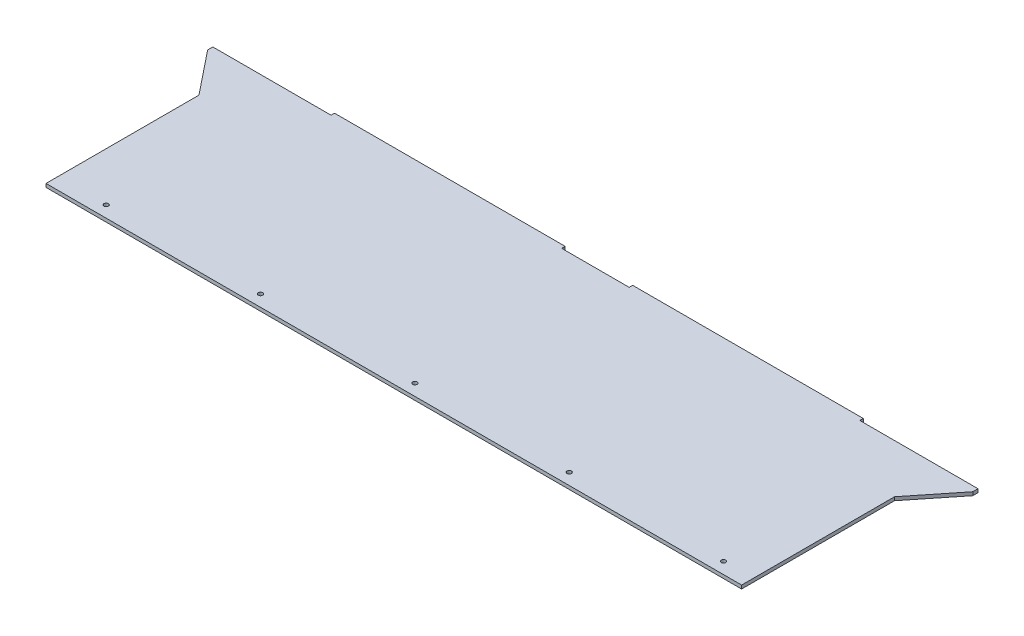
ISO-10303-21;
HEADER;
FILE_DESCRIPTION(('STEP AP214'),'2;1');
FILE_NAME('part.step','',(''),(''),'','','');
FILE_SCHEMA(('AUTOMOTIVE_DESIGN { 1 0 10303 214 1 1 1 1 }'));
ENDSEC;
DATA;
#1=APPLICATION_CONTEXT('core data for automotive mechanical design processes');
#2=APPLICATION_PROTOCOL_DEFINITION('international standard','automotive_design',2000,#1);
#3=PRODUCT_CONTEXT('',#1,'mechanical');
#4=PRODUCT('Part','Part','',(#3));
#5=PRODUCT_RELATED_PRODUCT_CATEGORY('part','',(#4));
#6=PRODUCT_DEFINITION_FORMATION('','',#4);
#7=PRODUCT_DEFINITION_CONTEXT('part definition',#1,'design');
#8=PRODUCT_DEFINITION('design','',#6,#7);
#9=PRODUCT_DEFINITION_SHAPE('','',#8);
#10=(LENGTH_UNIT() NAMED_UNIT(*) SI_UNIT(.MILLI.,.METRE.));
#11=(NAMED_UNIT(*) PLANE_ANGLE_UNIT() SI_UNIT($,.RADIAN.));
#12=(NAMED_UNIT(*) SI_UNIT($,.STERADIAN.) SOLID_ANGLE_UNIT());
#13=UNCERTAINTY_MEASURE_WITH_UNIT(LENGTH_MEASURE(1.E-05),#10,'distance_accuracy_value','');
#14=(GEOMETRIC_REPRESENTATION_CONTEXT(3) GLOBAL_UNCERTAINTY_ASSIGNED_CONTEXT((#13)) GLOBAL_UNIT_ASSIGNED_CONTEXT((#10,
#11,#12)) REPRESENTATION_CONTEXT('',''));
#15=CARTESIAN_POINT('',(0.,0.,0.));
#16=DIRECTION('',(0.,0.,1.));
#17=DIRECTION('',(1.,0.,0.));
#18=AXIS2_PLACEMENT_3D('',#15,#16,#17);
#19=CARTESIAN_POINT('',(290.6522,-8.4125,81.534));
#20=DIRECTION('',(0.,1.,0.));
#21=DIRECTION('',(0.,0.,1.));
#22=AXIS2_PLACEMENT_3D('',#19,#20,#21);
#23=CYLINDRICAL_SURFACE('',#22,2.02500000000001);
#24=CARTESIAN_POINT('',(290.6522,1.5875,81.534));
#25=DIRECTION('',(0.,1.,0.));
#26=DIRECTION('',(0.,0.,1.));
#27=AXIS2_PLACEMENT_3D('',#24,#25,#26);
#28=CIRCLE('',#27,2.02500000000001);
#29=CARTESIAN_POINT('',(290.6522,1.5875,83.559));
#30=VERTEX_POINT('',#29);
#31=EDGE_CURVE('E42',#30,#30,#28,.T.);
#32=ORIENTED_EDGE('',*,*,#31,.T.);
#33=EDGE_LOOP('',(#32));
#34=FACE_BOUND('',#33,.T.);
#35=CARTESIAN_POINT('',(290.6522,-1.5875,81.534));
#36=DIRECTION('',(0.,1.,0.));
#37=DIRECTION('',(0.,0.,1.));
#38=AXIS2_PLACEMENT_3D('',#35,#36,#37);
#39=CIRCLE('',#38,2.02500000000001);
#40=CARTESIAN_POINT('',(290.6522,-1.5875,83.559));
#41=VERTEX_POINT('',#40);
#42=EDGE_CURVE('E11',#41,#41,#39,.T.);
#43=ORIENTED_EDGE('',*,*,#42,.F.);
#44=EDGE_LOOP('',(#43));
#45=FACE_BOUND('',#44,.T.);
#46=ADVANCED_FACE('F35',(#34,#45),#23,.F.);
#47=CARTESIAN_POINT('',(149.6822,-8.4125,81.534));
#48=DIRECTION('',(0.,1.,0.));
#49=DIRECTION('',(0.,0.,1.));
#50=AXIS2_PLACEMENT_3D('',#47,#48,#49);
#51=CYLINDRICAL_SURFACE('',#50,2.02500000000001);
#52=CARTESIAN_POINT('',(149.6822,1.5875,81.534));
#53=DIRECTION('',(0.,1.,0.));
#54=DIRECTION('',(0.,0.,1.));
#55=AXIS2_PLACEMENT_3D('',#52,#53,#54);
#56=CIRCLE('',#55,2.02500000000001);
#57=CARTESIAN_POINT('',(149.6822,1.5875,83.559));
#58=VERTEX_POINT('',#57);
#59=EDGE_CURVE('E286',#58,#58,#56,.T.);
#60=ORIENTED_EDGE('',*,*,#59,.T.);
#61=EDGE_LOOP('',(#60));
#62=FACE_BOUND('',#61,.T.);
#63=CARTESIAN_POINT('',(149.6822,-1.5875,81.534));
#64=DIRECTION('',(0.,1.,0.));
#65=DIRECTION('',(0.,0.,1.));
#66=AXIS2_PLACEMENT_3D('',#63,#64,#65);
#67=CIRCLE('',#66,2.02500000000001);
#68=CARTESIAN_POINT('',(149.6822,-1.5875,83.559));
#69=VERTEX_POINT('',#68);
#70=EDGE_CURVE('E289',#69,#69,#67,.T.);
#71=ORIENTED_EDGE('',*,*,#70,.F.);
#72=EDGE_LOOP('',(#71));
#73=FACE_BOUND('',#72,.T.);
#74=ADVANCED_FACE('F314',(#62,#73),#51,.F.);
#75=CARTESIAN_POINT('',(8.71219999999989,-8.4125,81.534));
#76=DIRECTION('',(0.,1.,0.));
#77=DIRECTION('',(0.,0.,1.));
#78=AXIS2_PLACEMENT_3D('',#75,#76,#77);
#79=CYLINDRICAL_SURFACE('',#78,2.02500000000001);
#80=CARTESIAN_POINT('',(8.71219999999989,1.5875,81.534));
#81=DIRECTION('',(0.,1.,0.));
#82=DIRECTION('',(0.,0.,1.));
#83=AXIS2_PLACEMENT_3D('',#80,#81,#82);
#84=CIRCLE('',#83,2.02500000000001);
#85=CARTESIAN_POINT('',(8.71219999999989,1.5875,83.559));
#86=VERTEX_POINT('',#85);
#87=EDGE_CURVE('E278',#86,#86,#84,.T.);
#88=ORIENTED_EDGE('',*,*,#87,.T.);
#89=EDGE_LOOP('',(#88));
#90=FACE_BOUND('',#89,.T.);
#91=CARTESIAN_POINT('',(8.71219999999989,-1.5875,81.534));
#92=DIRECTION('',(0.,1.,0.));
#93=DIRECTION('',(0.,0.,1.));
#94=AXIS2_PLACEMENT_3D('',#91,#92,#93);
#95=CIRCLE('',#94,2.02500000000001);
#96=CARTESIAN_POINT('',(8.71219999999989,-1.5875,83.559));
#97=VERTEX_POINT('',#96);
#98=EDGE_CURVE('E283',#97,#97,#95,.T.);
#99=ORIENTED_EDGE('',*,*,#98,.F.);
#100=EDGE_LOOP('',(#99));
#101=FACE_BOUND('',#100,.T.);
#102=ADVANCED_FACE('F318',(#90,#101),#79,.F.);
#103=CARTESIAN_POINT('',(-317.6778,1.5875,-92.075));
#104=DIRECTION('',(1.,0.,0.));
#105=DIRECTION('',(0.,0.,-1.));
#106=AXIS2_PLACEMENT_3D('',#103,#104,#105);
#107=PLANE('',#106);
#108=DIRECTION('',(0.,1.,0.));
#109=VECTOR('',#108,1.);
#110=CARTESIAN_POINT('',(-317.6778,-1.5875,-47.6250000000001));
#111=LINE('',#110,#109);
#112=CARTESIAN_POINT('',(-317.6778,-1.5875,-47.6250000000001));
#113=VERTEX_POINT('',#112);
#114=CARTESIAN_POINT('',(-317.6778,1.5875,-47.6250000000001));
#115=VERTEX_POINT('',#114);
#116=EDGE_CURVE('E57',#113,#115,#111,.T.);
#117=ORIENTED_EDGE('',*,*,#116,.F.);
#118=DIRECTION('',(0.,0.,1.));
#119=VECTOR('',#118,1.);
#120=CARTESIAN_POINT('',(-317.6778,-1.5875,-92.075));
#121=LINE('',#120,#119);
#122=CARTESIAN_POINT('',(-317.6778,-1.5875,92.075));
#123=VERTEX_POINT('',#122);
#124=EDGE_CURVE('E161',#113,#123,#121,.T.);
#125=ORIENTED_EDGE('',*,*,#124,.T.);
#126=DIRECTION('',(0.,-1.,0.));
#127=VECTOR('',#126,1.);
#128=CARTESIAN_POINT('',(-317.6778,1.5875,92.075));
#129=LINE('',#128,#127);
#130=CARTESIAN_POINT('',(-317.6778,1.5875,92.075));
#131=VERTEX_POINT('',#130);
#132=EDGE_CURVE('E275',#131,#123,#129,.T.);
#133=ORIENTED_EDGE('',*,*,#132,.F.);
#134=DIRECTION('',(0.,0.,1.));
#135=VECTOR('',#134,1.);
#136=CARTESIAN_POINT('',(-317.6778,1.5875,-92.075));
#137=LINE('',#136,#135);
#138=EDGE_CURVE('E263',#115,#131,#137,.T.);
#139=ORIENTED_EDGE('',*,*,#138,.F.);
#140=EDGE_LOOP('',(#117,#125,#133,#139));
#141=FACE_BOUND('',#140,.T.);
#142=ADVANCED_FACE('F323',(#141),#107,.F.);
#143=CARTESIAN_POINT('',(-317.6778,1.5875,-92.075));
#144=DIRECTION('',(0.,0.,1.));
#145=DIRECTION('',(1.,0.,0.));
#146=AXIS2_PLACEMENT_3D('',#143,#144,#145);
#147=PLANE('',#146);
#148=DIRECTION('',(0.,1.,0.));
#149=VECTOR('',#148,1.);
#150=CARTESIAN_POINT('',(-241.4778,0.,-92.075));
#151=LINE('',#150,#149);
#152=CARTESIAN_POINT('',(-241.4778,-1.5875,-92.075));
#153=VERTEX_POINT('',#152);
#154=CARTESIAN_POINT('',(-241.4778,1.5875,-92.075));
#155=VERTEX_POINT('',#154);
#156=EDGE_CURVE('E213',#153,#155,#151,.T.);
#157=ORIENTED_EDGE('',*,*,#156,.F.);
#158=DIRECTION('',(-1.,0.,0.));
#159=VECTOR('',#158,1.);
#160=CARTESIAN_POINT('',(-317.6778,-1.5875,-92.075));
#161=LINE('',#160,#159);
#162=CARTESIAN_POINT('',(-349.4278,-1.5875,-92.075));
#163=VERTEX_POINT('',#162);
#164=EDGE_CURVE('E164',#153,#163,#161,.T.);
#165=ORIENTED_EDGE('',*,*,#164,.T.);
#166=DIRECTION('',(0.,1.,0.));
#167=VECTOR('',#166,1.);
#168=CARTESIAN_POINT('',(-349.4278,-1.5875,-92.075));
#169=LINE('',#168,#167);
#170=CARTESIAN_POINT('',(-349.4278,1.5875,-92.075));
#171=VERTEX_POINT('',#170);
#172=EDGE_CURVE('E203',#163,#171,#169,.T.);
#173=ORIENTED_EDGE('',*,*,#172,.T.);
#174=DIRECTION('',(-1.,0.,0.));
#175=VECTOR('',#174,1.);
#176=CARTESIAN_POINT('',(-317.6778,1.5875,-92.075));
#177=LINE('',#176,#175);
#178=EDGE_CURVE('E260',#155,#171,#177,.T.);
#179=ORIENTED_EDGE('',*,*,#178,.F.);
#180=EDGE_LOOP('',(#157,#165,#173,#179));
#181=FACE_BOUND('',#180,.T.);
#182=ADVANCED_FACE('F335',(#181),#147,.F.);
#183=CARTESIAN_POINT('',(30.8229000000015,-1.5875,-92.075));
#184=VERTEX_POINT('',#183);
#185=CARTESIAN_POINT('',(-30.8229000000015,-1.5875,-92.075));
#186=VERTEX_POINT('',#185);
#187=EDGE_CURVE('E162',#184,#186,#161,.T.);
#188=ORIENTED_EDGE('',*,*,#187,.T.);
#189=DIRECTION('',(0.,1.,0.));
#190=VECTOR('',#189,1.);
#191=CARTESIAN_POINT('',(-30.8229000000015,0.,-92.075));
#192=LINE('',#191,#190);
#193=CARTESIAN_POINT('',(-30.8229000000015,1.5875,-92.075));
#194=VERTEX_POINT('',#193);
#195=EDGE_CURVE('E206',#186,#194,#192,.T.);
#196=ORIENTED_EDGE('',*,*,#195,.T.);
#197=CARTESIAN_POINT('',(30.8229000000015,1.5875,-92.075));
#198=VERTEX_POINT('',#197);
#199=EDGE_CURVE('E264',#198,#194,#177,.T.);
#200=ORIENTED_EDGE('',*,*,#199,.F.);
#201=DIRECTION('',(0.,-1.,0.));
#202=VECTOR('',#201,1.);
#203=CARTESIAN_POINT('',(30.8229000000015,0.,-92.075));
#204=LINE('',#203,#202);
#205=EDGE_CURVE('E234',#198,#184,#204,.T.);
#206=ORIENTED_EDGE('',*,*,#205,.T.);
#207=EDGE_LOOP('',(#188,#196,#200,#206));
#208=FACE_BOUND('',#207,.T.);
#209=ADVANCED_FACE('F331',(#208),#147,.F.);
#210=CARTESIAN_POINT('',(317.6778,1.5875,-92.075));
#211=DIRECTION('',(-1.,0.,0.));
#212=DIRECTION('',(0.,0.,1.));
#213=AXIS2_PLACEMENT_3D('',#210,#211,#212);
#214=PLANE('',#213);
#215=DIRECTION('',(0.,0.,-1.));
#216=VECTOR('',#215,1.);
#217=CARTESIAN_POINT('',(317.6778,-1.5875,-92.075));
#218=LINE('',#217,#216);
#219=CARTESIAN_POINT('',(317.6778,-1.5875,92.075));
#220=VERTEX_POINT('',#219);
#221=CARTESIAN_POINT('',(317.6778,-1.5875,-47.6250000000001));
#222=VERTEX_POINT('',#221);
#223=EDGE_CURVE('E256',#220,#222,#218,.T.);
#224=ORIENTED_EDGE('',*,*,#223,.T.);
#225=DIRECTION('',(0.,1.,0.));
#226=VECTOR('',#225,1.);
#227=CARTESIAN_POINT('',(317.6778,-1.5875,-47.6250000000001));
#228=LINE('',#227,#226);
#229=CARTESIAN_POINT('',(317.6778,1.5875,-47.6250000000001));
#230=VERTEX_POINT('',#229);
#231=EDGE_CURVE('E173',#222,#230,#228,.T.);
#232=ORIENTED_EDGE('',*,*,#231,.T.);
#233=DIRECTION('',(0.,0.,-1.));
#234=VECTOR('',#233,1.);
#235=CARTESIAN_POINT('',(317.6778,1.5875,-92.075));
#236=LINE('',#235,#234);
#237=CARTESIAN_POINT('',(317.6778,1.5875,92.075));
#238=VERTEX_POINT('',#237);
#239=EDGE_CURVE('E257',#238,#230,#236,.T.);
#240=ORIENTED_EDGE('',*,*,#239,.F.);
#241=DIRECTION('',(0.,-1.,0.));
#242=VECTOR('',#241,1.);
#243=CARTESIAN_POINT('',(317.6778,1.5875,92.075));
#244=LINE('',#243,#242);
#245=EDGE_CURVE('E268',#238,#220,#244,.T.);
#246=ORIENTED_EDGE('',*,*,#245,.T.);
#247=EDGE_LOOP('',(#224,#232,#240,#246));
#248=FACE_BOUND('',#247,.T.);
#249=ADVANCED_FACE('F328',(#248),#214,.F.);
#250=CARTESIAN_POINT('',(349.4278,-1.5875,-92.075));
#251=VERTEX_POINT('',#250);
#252=CARTESIAN_POINT('',(241.4778,-1.5875,-92.075));
#253=VERTEX_POINT('',#252);
#254=EDGE_CURVE('E148',#251,#253,#161,.T.);
#255=ORIENTED_EDGE('',*,*,#254,.T.);
#256=DIRECTION('',(0.,1.,0.));
#257=VECTOR('',#256,1.);
#258=CARTESIAN_POINT('',(241.4778,2.1109780590225E-11,-92.075));
#259=LINE('',#258,#257);
#260=CARTESIAN_POINT('',(241.4778,1.5875,-92.075));
#261=VERTEX_POINT('',#260);
#262=EDGE_CURVE('E239',#253,#261,#259,.T.);
#263=ORIENTED_EDGE('',*,*,#262,.T.);
#264=CARTESIAN_POINT('',(349.4278,1.5875,-92.075));
#265=VERTEX_POINT('',#264);
#266=EDGE_CURVE('E169',#265,#261,#177,.T.);
#267=ORIENTED_EDGE('',*,*,#266,.F.);
#268=DIRECTION('',(0.,1.,0.));
#269=VECTOR('',#268,1.);
#270=CARTESIAN_POINT('',(349.4278,-1.5875,-92.075));
#271=LINE('',#270,#269);
#272=EDGE_CURVE('E166',#251,#265,#271,.T.);
#273=ORIENTED_EDGE('',*,*,#272,.F.);
#274=EDGE_LOOP('',(#255,#263,#267,#273));
#275=FACE_BOUND('',#274,.T.);
#276=ADVANCED_FACE('F167',(#275),#147,.F.);
#277=CARTESIAN_POINT('',(-317.6778,1.5875,92.075));
#278=DIRECTION('',(0.,0.,-1.));
#279=DIRECTION('',(-1.,0.,0.));
#280=AXIS2_PLACEMENT_3D('',#277,#278,#279);
#281=PLANE('',#280);
#282=DIRECTION('',(1.,0.,0.));
#283=VECTOR('',#282,1.);
#284=CARTESIAN_POINT('',(-317.6778,-1.5875,92.075));
#285=LINE('',#284,#283);
#286=EDGE_CURVE('E261',#123,#220,#285,.T.);
#287=ORIENTED_EDGE('',*,*,#286,.T.);
#288=ORIENTED_EDGE('',*,*,#245,.F.);
#289=DIRECTION('',(1.,0.,0.));
#290=VECTOR('',#289,1.);
#291=CARTESIAN_POINT('',(-317.6778,1.5875,92.075));
#292=LINE('',#291,#290);
#293=EDGE_CURVE('E266',#131,#238,#292,.T.);
#294=ORIENTED_EDGE('',*,*,#293,.F.);
#295=ORIENTED_EDGE('',*,*,#132,.T.);
#296=EDGE_LOOP('',(#287,#288,#294,#295));
#297=FACE_BOUND('',#296,.T.);
#298=ADVANCED_FACE('F298',(#297),#281,.F.);
#299=CARTESIAN_POINT('',(0.,1.5875,0.));
#300=DIRECTION('',(0.,1.,0.));
#301=DIRECTION('',(0.,0.,1.));
#302=AXIS2_PLACEMENT_3D('',#299,#300,#301);
#303=PLANE('',#302);
#304=CARTESIAN_POINT('',(-132.2578,1.5875,81.534));
#305=DIRECTION('',(0.,1.,0.));
#306=DIRECTION('',(0.,0.,1.));
#307=AXIS2_PLACEMENT_3D('',#304,#305,#306);
#308=CIRCLE('',#307,2.02500000000001);
#309=CARTESIAN_POINT('',(-132.2578,1.5875,83.559));
#310=VERTEX_POINT('',#309);
#311=EDGE_CURVE('E507',#310,#310,#308,.T.);
#312=ORIENTED_EDGE('',*,*,#311,.F.);
#313=EDGE_LOOP('',(#312));
#314=FACE_BOUND('',#313,.T.);
#315=CARTESIAN_POINT('',(-273.2278,1.5875,81.534));
#316=DIRECTION('',(0.,1.,0.));
#317=DIRECTION('',(0.,0.,1.));
#318=AXIS2_PLACEMENT_3D('',#315,#316,#317);
#319=CIRCLE('',#318,2.02500000000001);
#320=CARTESIAN_POINT('',(-273.2278,1.5875,83.559));
#321=VERTEX_POINT('',#320);
#322=EDGE_CURVE('E183',#321,#321,#319,.T.);
#323=ORIENTED_EDGE('',*,*,#322,.F.);
#324=EDGE_LOOP('',(#323));
#325=FACE_BOUND('',#324,.T.);
#326=ORIENTED_EDGE('',*,*,#239,.T.);
#327=DIRECTION('',(-0.624695047554425,0.,0.78086880944303));
#328=VECTOR('',#327,1.);
#329=CARTESIAN_POINT('',(170.474268292683,1.5875,136.379414634146));
#330=LINE('',#329,#328);
#331=CARTESIAN_POINT('',(349.4278,1.5875,-87.3125));
#332=VERTEX_POINT('',#331);
#333=EDGE_CURVE('E49',#332,#230,#330,.T.);
#334=ORIENTED_EDGE('',*,*,#333,.F.);
#335=DIRECTION('',(0.,0.,1.));
#336=VECTOR('',#335,1.);
#337=CARTESIAN_POINT('',(349.4278,1.5875,0.));
#338=LINE('',#337,#336);
#339=EDGE_CURVE('E180',#265,#332,#338,.T.);
#340=ORIENTED_EDGE('',*,*,#339,.F.);
#341=ORIENTED_EDGE('',*,*,#266,.T.);
#342=DIRECTION('',(0.,0.,1.));
#343=VECTOR('',#342,1.);
#344=CARTESIAN_POINT('',(241.4778,1.5875,-95.25));
#345=LINE('',#344,#343);
#346=CARTESIAN_POINT('',(241.4778,1.5875,-95.25));
#347=VERTEX_POINT('',#346);
#348=EDGE_CURVE('E252',#347,#261,#345,.T.);
#349=ORIENTED_EDGE('',*,*,#348,.F.);
#350=DIRECTION('',(1.,0.,0.));
#351=VECTOR('',#350,1.);
#352=CARTESIAN_POINT('',(0.,1.5875,-95.25));
#353=LINE('',#352,#351);
#354=CARTESIAN_POINT('',(30.8229000000015,1.5875,-95.25));
#355=VERTEX_POINT('',#354);
#356=EDGE_CURVE('E238',#355,#347,#353,.T.);
#357=ORIENTED_EDGE('',*,*,#356,.F.);
#358=DIRECTION('',(0.,0.,1.));
#359=VECTOR('',#358,1.);
#360=CARTESIAN_POINT('',(30.8229000000015,1.5875,-95.25));
#361=LINE('',#360,#359);
#362=EDGE_CURVE('E254',#355,#198,#361,.T.);
#363=ORIENTED_EDGE('',*,*,#362,.T.);
#364=ORIENTED_EDGE('',*,*,#199,.T.);
#365=DIRECTION('',(0.,0.,1.));
#366=VECTOR('',#365,1.);
#367=CARTESIAN_POINT('',(-30.8229000000015,1.5875,-95.25));
#368=LINE('',#367,#366);
#369=CARTESIAN_POINT('',(-30.8229000000015,1.5875,-95.25));
#370=VERTEX_POINT('',#369);
#371=EDGE_CURVE('E219',#370,#194,#368,.T.);
#372=ORIENTED_EDGE('',*,*,#371,.F.);
#373=DIRECTION('',(1.,0.,0.));
#374=VECTOR('',#373,1.);
#375=CARTESIAN_POINT('',(0.,1.5875,-95.25));
#376=LINE('',#375,#374);
#377=CARTESIAN_POINT('',(-241.4778,1.5875,-95.25));
#378=VERTEX_POINT('',#377);
#379=EDGE_CURVE('E217',#378,#370,#376,.T.);
#380=ORIENTED_EDGE('',*,*,#379,.F.);
#381=DIRECTION('',(0.,0.,1.));
#382=VECTOR('',#381,1.);
#383=CARTESIAN_POINT('',(-241.4778,1.5875,-95.25));
#384=LINE('',#383,#382);
#385=EDGE_CURVE('E225',#378,#155,#384,.T.);
#386=ORIENTED_EDGE('',*,*,#385,.T.);
#387=ORIENTED_EDGE('',*,*,#178,.T.);
#388=DIRECTION('',(0.,0.,1.));
#389=VECTOR('',#388,1.);
#390=CARTESIAN_POINT('',(-349.4278,1.5875,0.));
#391=LINE('',#390,#389);
#392=CARTESIAN_POINT('',(-349.4278,1.5875,-87.3125));
#393=VERTEX_POINT('',#392);
#394=EDGE_CURVE('E189',#171,#393,#391,.T.);
#395=ORIENTED_EDGE('',*,*,#394,.T.);
#396=DIRECTION('',(0.624695047554425,0.,0.78086880944303));
#397=VECTOR('',#396,1.);
#398=CARTESIAN_POINT('',(-170.474268292683,1.5875,136.379414634146));
#399=LINE('',#398,#397);
#400=EDGE_CURVE('E195',#393,#115,#399,.T.);
#401=ORIENTED_EDGE('',*,*,#400,.T.);
#402=ORIENTED_EDGE('',*,*,#138,.T.);
#403=ORIENTED_EDGE('',*,*,#293,.T.);
#404=EDGE_LOOP('',(#326,#334,#340,#341,#349,#357,#363,#364,#372,#380,#386,#387,#395,#401,#402,#403));
#405=FACE_BOUND('',#404,.T.);
#406=ORIENTED_EDGE('',*,*,#87,.F.);
#407=EDGE_LOOP('',(#406));
#408=FACE_BOUND('',#407,.T.);
#409=ORIENTED_EDGE('',*,*,#59,.F.);
#410=EDGE_LOOP('',(#409));
#411=FACE_BOUND('',#410,.T.);
#412=ORIENTED_EDGE('',*,*,#31,.F.);
#413=EDGE_LOOP('',(#412));
#414=FACE_BOUND('',#413,.T.);
#415=ADVANCED_FACE('F296',(#314,#325,#405,#408,#411,#414),#303,.T.);
#416=CARTESIAN_POINT('',(0.,-1.5875,0.));
#417=DIRECTION('',(0.,1.,0.));
#418=DIRECTION('',(0.,0.,1.));
#419=AXIS2_PLACEMENT_3D('',#416,#417,#418);
#420=PLANE('',#419);
#421=CARTESIAN_POINT('',(-132.2578,-1.5875,81.534));
#422=DIRECTION('',(0.,1.,0.));
#423=DIRECTION('',(0.,0.,1.));
#424=AXIS2_PLACEMENT_3D('',#421,#422,#423);
#425=CIRCLE('',#424,2.02500000000001);
#426=CARTESIAN_POINT('',(-132.2578,-1.5875,83.559));
#427=VERTEX_POINT('',#426);
#428=EDGE_CURVE('E510',#427,#427,#425,.T.);
#429=ORIENTED_EDGE('',*,*,#428,.T.);
#430=EDGE_LOOP('',(#429));
#431=FACE_BOUND('',#430,.T.);
#432=CARTESIAN_POINT('',(-273.2278,-1.5875,81.534));
#433=DIRECTION('',(0.,1.,0.));
#434=DIRECTION('',(0.,0.,1.));
#435=AXIS2_PLACEMENT_3D('',#432,#433,#434);
#436=CIRCLE('',#435,2.02500000000001);
#437=CARTESIAN_POINT('',(-273.2278,-1.5875,83.559));
#438=VERTEX_POINT('',#437);
#439=EDGE_CURVE('E186',#438,#438,#436,.T.);
#440=ORIENTED_EDGE('',*,*,#439,.T.);
#441=EDGE_LOOP('',(#440));
#442=FACE_BOUND('',#441,.T.);
#443=ORIENTED_EDGE('',*,*,#223,.F.);
#444=ORIENTED_EDGE('',*,*,#286,.F.);
#445=ORIENTED_EDGE('',*,*,#124,.F.);
#446=DIRECTION('',(0.624695047554425,0.,0.78086880944303));
#447=VECTOR('',#446,1.);
#448=CARTESIAN_POINT('',(-170.474268292683,-1.5875,136.379414634146));
#449=LINE('',#448,#447);
#450=CARTESIAN_POINT('',(-349.4278,-1.5875,-87.3125));
#451=VERTEX_POINT('',#450);
#452=EDGE_CURVE('E194',#451,#113,#449,.T.);
#453=ORIENTED_EDGE('',*,*,#452,.F.);
#454=DIRECTION('',(0.,0.,1.));
#455=VECTOR('',#454,1.);
#456=CARTESIAN_POINT('',(-349.4278,-1.5875,0.));
#457=LINE('',#456,#455);
#458=EDGE_CURVE('E191',#163,#451,#457,.T.);
#459=ORIENTED_EDGE('',*,*,#458,.F.);
#460=ORIENTED_EDGE('',*,*,#164,.F.);
#461=DIRECTION('',(0.,0.,1.));
#462=VECTOR('',#461,1.);
#463=CARTESIAN_POINT('',(-241.4778,-1.5875,-95.25));
#464=LINE('',#463,#462);
#465=CARTESIAN_POINT('',(-241.4778,-1.5875,-95.25));
#466=VERTEX_POINT('',#465);
#467=EDGE_CURVE('E228',#466,#153,#464,.T.);
#468=ORIENTED_EDGE('',*,*,#467,.F.);
#469=DIRECTION('',(-1.,0.,0.));
#470=VECTOR('',#469,1.);
#471=CARTESIAN_POINT('',(0.,-1.5875,-95.25));
#472=LINE('',#471,#470);
#473=CARTESIAN_POINT('',(-30.8229000000015,-1.5875,-95.25));
#474=VERTEX_POINT('',#473);
#475=EDGE_CURVE('E212',#474,#466,#472,.T.);
#476=ORIENTED_EDGE('',*,*,#475,.F.);
#477=DIRECTION('',(0.,0.,1.));
#478=VECTOR('',#477,1.);
#479=CARTESIAN_POINT('',(-30.8229000000015,-1.5875,-95.25));
#480=LINE('',#479,#478);
#481=EDGE_CURVE('E231',#474,#186,#480,.T.);
#482=ORIENTED_EDGE('',*,*,#481,.T.);
#483=ORIENTED_EDGE('',*,*,#187,.F.);
#484=DIRECTION('',(0.,0.,1.));
#485=VECTOR('',#484,1.);
#486=CARTESIAN_POINT('',(30.8229000000015,-1.5875,-95.25));
#487=LINE('',#486,#485);
#488=CARTESIAN_POINT('',(30.8229000000015,-1.5875,-95.25));
#489=VERTEX_POINT('',#488);
#490=EDGE_CURVE('E246',#489,#184,#487,.T.);
#491=ORIENTED_EDGE('',*,*,#490,.F.);
#492=DIRECTION('',(-1.,0.,0.));
#493=VECTOR('',#492,1.);
#494=CARTESIAN_POINT('',(0.,-1.5875,-95.25));
#495=LINE('',#494,#493);
#496=CARTESIAN_POINT('',(241.4778,-1.5875,-95.25));
#497=VERTEX_POINT('',#496);
#498=EDGE_CURVE('E244',#497,#489,#495,.T.);
#499=ORIENTED_EDGE('',*,*,#498,.F.);
#500=DIRECTION('',(0.,0.,1.));
#501=VECTOR('',#500,1.);
#502=CARTESIAN_POINT('',(241.4778,-1.5875,-95.25));
#503=LINE('',#502,#501);
#504=EDGE_CURVE('E157',#497,#253,#503,.T.);
#505=ORIENTED_EDGE('',*,*,#504,.T.);
#506=ORIENTED_EDGE('',*,*,#254,.F.);
#507=DIRECTION('',(0.,0.,1.));
#508=VECTOR('',#507,1.);
#509=CARTESIAN_POINT('',(349.4278,-1.5875,0.));
#510=LINE('',#509,#508);
#511=CARTESIAN_POINT('',(349.4278,-1.5875,-87.3125));
#512=VERTEX_POINT('',#511);
#513=EDGE_CURVE('E154',#251,#512,#510,.T.);
#514=ORIENTED_EDGE('',*,*,#513,.T.);
#515=DIRECTION('',(-0.624695047554425,0.,0.78086880944303));
#516=VECTOR('',#515,1.);
#517=CARTESIAN_POINT('',(170.474268292683,-1.5875,136.379414634146));
#518=LINE('',#517,#516);
#519=EDGE_CURVE('E174',#512,#222,#518,.T.);
#520=ORIENTED_EDGE('',*,*,#519,.T.);
#521=EDGE_LOOP('',(#443,#444,#445,#453,#459,#460,#468,#476,#482,#483,#491,#499,#505,#506,#514,#520));
#522=FACE_BOUND('',#521,.T.);
#523=ORIENTED_EDGE('',*,*,#98,.T.);
#524=EDGE_LOOP('',(#523));
#525=FACE_BOUND('',#524,.T.);
#526=ORIENTED_EDGE('',*,*,#70,.T.);
#527=EDGE_LOOP('',(#526));
#528=FACE_BOUND('',#527,.T.);
#529=ORIENTED_EDGE('',*,*,#42,.T.);
#530=EDGE_LOOP('',(#529));
#531=FACE_BOUND('',#530,.T.);
#532=ADVANCED_FACE('F151',(#431,#442,#522,#525,#528,#531),#420,.F.);
#533=CARTESIAN_POINT('',(30.8229000000015,0.,-95.25));
#534=DIRECTION('',(-1.,0.,0.));
#535=DIRECTION('',(0.,-1.,0.));
#536=AXIS2_PLACEMENT_3D('',#533,#534,#535);
#537=PLANE('',#536);
#538=ORIENTED_EDGE('',*,*,#205,.F.);
#539=ORIENTED_EDGE('',*,*,#362,.F.);
#540=DIRECTION('',(0.,-1.,0.));
#541=VECTOR('',#540,1.);
#542=CARTESIAN_POINT('',(30.8229000000015,0.,-95.25));
#543=LINE('',#542,#541);
#544=EDGE_CURVE('E235',#355,#489,#543,.T.);
#545=ORIENTED_EDGE('',*,*,#544,.T.);
#546=ORIENTED_EDGE('',*,*,#490,.T.);
#547=EDGE_LOOP('',(#538,#539,#545,#546));
#548=FACE_BOUND('',#547,.T.);
#549=ADVANCED_FACE('F305',(#548),#537,.T.);
#550=CARTESIAN_POINT('',(241.4778,2.1109780590225E-11,-95.25));
#551=DIRECTION('',(1.,0.,0.));
#552=DIRECTION('',(0.,1.,0.));
#553=AXIS2_PLACEMENT_3D('',#550,#551,#552);
#554=PLANE('',#553);
#555=ORIENTED_EDGE('',*,*,#262,.F.);
#556=ORIENTED_EDGE('',*,*,#504,.F.);
#557=DIRECTION('',(0.,1.,0.));
#558=VECTOR('',#557,1.);
#559=CARTESIAN_POINT('',(241.4778,2.1109780590225E-11,-95.25));
#560=LINE('',#559,#558);
#561=EDGE_CURVE('E241',#497,#347,#560,.T.);
#562=ORIENTED_EDGE('',*,*,#561,.T.);
#563=ORIENTED_EDGE('',*,*,#348,.T.);
#564=EDGE_LOOP('',(#555,#556,#562,#563));
#565=FACE_BOUND('',#564,.T.);
#566=ADVANCED_FACE('F409',(#565),#554,.T.);
#567=CARTESIAN_POINT('',(0.,0.,-95.25));
#568=DIRECTION('',(0.,0.,-1.));
#569=DIRECTION('',(-1.,0.,0.));
#570=AXIS2_PLACEMENT_3D('',#567,#568,#569);
#571=PLANE('',#570);
#572=ORIENTED_EDGE('',*,*,#544,.F.);
#573=ORIENTED_EDGE('',*,*,#356,.T.);
#574=ORIENTED_EDGE('',*,*,#561,.F.);
#575=ORIENTED_EDGE('',*,*,#498,.T.);
#576=EDGE_LOOP('',(#572,#573,#574,#575));
#577=FACE_BOUND('',#576,.T.);
#578=ADVANCED_FACE('F406',(#577),#571,.T.);
#579=CARTESIAN_POINT('',(-30.8229000000015,0.,-95.25));
#580=DIRECTION('',(1.,0.,0.));
#581=DIRECTION('',(0.,0.,-1.));
#582=AXIS2_PLACEMENT_3D('',#579,#580,#581);
#583=PLANE('',#582);
#584=ORIENTED_EDGE('',*,*,#195,.F.);
#585=ORIENTED_EDGE('',*,*,#481,.F.);
#586=DIRECTION('',(0.,1.,0.));
#587=VECTOR('',#586,1.);
#588=CARTESIAN_POINT('',(-30.8229000000015,0.,-95.25));
#589=LINE('',#588,#587);
#590=EDGE_CURVE('E209',#474,#370,#589,.T.);
#591=ORIENTED_EDGE('',*,*,#590,.T.);
#592=ORIENTED_EDGE('',*,*,#371,.T.);
#593=EDGE_LOOP('',(#584,#585,#591,#592));
#594=FACE_BOUND('',#593,.T.);
#595=ADVANCED_FACE('F363',(#594),#583,.T.);
#596=CARTESIAN_POINT('',(-241.4778,0.,-95.25));
#597=DIRECTION('',(1.,0.,0.));
#598=DIRECTION('',(0.,0.,-1.));
#599=AXIS2_PLACEMENT_3D('',#596,#597,#598);
#600=PLANE('',#599);
#601=ORIENTED_EDGE('',*,*,#156,.T.);
#602=ORIENTED_EDGE('',*,*,#385,.F.);
#603=DIRECTION('',(0.,1.,0.));
#604=VECTOR('',#603,1.);
#605=CARTESIAN_POINT('',(-241.4778,0.,-95.25));
#606=LINE('',#605,#604);
#607=EDGE_CURVE('E215',#466,#378,#606,.T.);
#608=ORIENTED_EDGE('',*,*,#607,.F.);
#609=ORIENTED_EDGE('',*,*,#467,.T.);
#610=EDGE_LOOP('',(#601,#602,#608,#609));
#611=FACE_BOUND('',#610,.T.);
#612=ADVANCED_FACE('F351',(#611),#600,.F.);
#613=CARTESIAN_POINT('',(0.,0.,-95.25));
#614=DIRECTION('',(0.,0.,-1.));
#615=DIRECTION('',(-1.,0.,0.));
#616=AXIS2_PLACEMENT_3D('',#613,#614,#615);
#617=PLANE('',#616);
#618=ORIENTED_EDGE('',*,*,#590,.F.);
#619=ORIENTED_EDGE('',*,*,#475,.T.);
#620=ORIENTED_EDGE('',*,*,#607,.T.);
#621=ORIENTED_EDGE('',*,*,#379,.T.);
#622=EDGE_LOOP('',(#618,#619,#620,#621));
#623=FACE_BOUND('',#622,.T.);
#624=ADVANCED_FACE('F398',(#623),#617,.T.);
#625=CARTESIAN_POINT('',(-349.4278,-1.5875,0.));
#626=DIRECTION('',(-1.,0.,0.));
#627=DIRECTION('',(0.,0.,1.));
#628=AXIS2_PLACEMENT_3D('',#625,#626,#627);
#629=PLANE('',#628);
#630=ORIENTED_EDGE('',*,*,#394,.F.);
#631=ORIENTED_EDGE('',*,*,#172,.F.);
#632=ORIENTED_EDGE('',*,*,#458,.T.);
#633=DIRECTION('',(0.,1.,0.));
#634=VECTOR('',#633,1.);
#635=CARTESIAN_POINT('',(-349.4278,-1.5875,-87.3125));
#636=LINE('',#635,#634);
#637=EDGE_CURVE('E198',#451,#393,#636,.T.);
#638=ORIENTED_EDGE('',*,*,#637,.T.);
#639=EDGE_LOOP('',(#630,#631,#632,#638));
#640=FACE_BOUND('',#639,.T.);
#641=ADVANCED_FACE('F371',(#640),#629,.T.);
#642=CARTESIAN_POINT('',(-170.474268292683,-1.5875,136.379414634146));
#643=DIRECTION('',(-0.78086880944303,0.,0.624695047554425));
#644=DIRECTION('',(0.624695047554425,0.,0.78086880944303));
#645=AXIS2_PLACEMENT_3D('',#642,#643,#644);
#646=PLANE('',#645);
#647=ORIENTED_EDGE('',*,*,#400,.F.);
#648=ORIENTED_EDGE('',*,*,#637,.F.);
#649=ORIENTED_EDGE('',*,*,#452,.T.);
#650=ORIENTED_EDGE('',*,*,#116,.T.);
#651=EDGE_LOOP('',(#647,#648,#649,#650));
#652=FACE_BOUND('',#651,.T.);
#653=ADVANCED_FACE('F374',(#652),#646,.T.);
#654=CARTESIAN_POINT('',(349.4278,-1.5875,0.));
#655=DIRECTION('',(-1.,0.,0.));
#656=DIRECTION('',(0.,0.,1.));
#657=AXIS2_PLACEMENT_3D('',#654,#655,#656);
#658=PLANE('',#657);
#659=ORIENTED_EDGE('',*,*,#339,.T.);
#660=DIRECTION('',(0.,1.,0.));
#661=VECTOR('',#660,1.);
#662=CARTESIAN_POINT('',(349.4278,-1.5875,-87.3125));
#663=LINE('',#662,#661);
#664=EDGE_CURVE('E177',#512,#332,#663,.T.);
#665=ORIENTED_EDGE('',*,*,#664,.F.);
#666=ORIENTED_EDGE('',*,*,#513,.F.);
#667=ORIENTED_EDGE('',*,*,#272,.T.);
#668=EDGE_LOOP('',(#659,#665,#666,#667));
#669=FACE_BOUND('',#668,.T.);
#670=ADVANCED_FACE('F176',(#669),#658,.F.);
#671=CARTESIAN_POINT('',(170.474268292683,-1.5875,136.379414634146));
#672=DIRECTION('',(-0.78086880944303,0.,-0.624695047554425));
#673=DIRECTION('',(-0.624695047554425,0.,0.78086880944303));
#674=AXIS2_PLACEMENT_3D('',#671,#672,#673);
#675=PLANE('',#674);
#676=ORIENTED_EDGE('',*,*,#333,.T.);
#677=ORIENTED_EDGE('',*,*,#231,.F.);
#678=ORIENTED_EDGE('',*,*,#519,.F.);
#679=ORIENTED_EDGE('',*,*,#664,.T.);
#680=EDGE_LOOP('',(#676,#677,#678,#679));
#681=FACE_BOUND('',#680,.T.);
#682=ADVANCED_FACE('F380',(#681),#675,.F.);
#683=CARTESIAN_POINT('',(-273.2278,-8.4125,81.534));
#684=DIRECTION('',(0.,1.,0.));
#685=DIRECTION('',(0.,0.,1.));
#686=AXIS2_PLACEMENT_3D('',#683,#684,#685);
#687=CYLINDRICAL_SURFACE('',#686,2.02500000000001);
#688=ORIENTED_EDGE('',*,*,#322,.T.);
#689=EDGE_LOOP('',(#688));
#690=FACE_BOUND('',#689,.T.);
#691=ORIENTED_EDGE('',*,*,#439,.F.);
#692=EDGE_LOOP('',(#691));
#693=FACE_BOUND('',#692,.T.);
#694=ADVANCED_FACE('F382',(#690,#693),#687,.F.);
#695=CARTESIAN_POINT('',(-132.2578,-8.4125,81.534));
#696=DIRECTION('',(0.,1.,0.));
#697=DIRECTION('',(0.,0.,1.));
#698=AXIS2_PLACEMENT_3D('',#695,#696,#697);
#699=CYLINDRICAL_SURFACE('',#698,2.02500000000001);
#700=ORIENTED_EDGE('',*,*,#311,.T.);
#701=EDGE_LOOP('',(#700));
#702=FACE_BOUND('',#701,.T.);
#703=ORIENTED_EDGE('',*,*,#428,.F.);
#704=EDGE_LOOP('',(#703));
#705=FACE_BOUND('',#704,.T.);
#706=ADVANCED_FACE('F388',(#702,#705),#699,.F.);
#707=CLOSED_SHELL('',(#46,#74,#102,#142,#182,#209,#249,#276,#298,#415,#532,#549,#566,#578,#595,
#612,#624,#641,#653,#670,#682,#694,#706));
#708=MANIFOLD_SOLID_BREP('B2',#707);
#709=ADVANCED_BREP_SHAPE_REPRESENTATION('',(#18,#708),#14);
#710=SHAPE_DEFINITION_REPRESENTATION(#9,#709);
ENDSEC;
END-ISO-10303-21;
